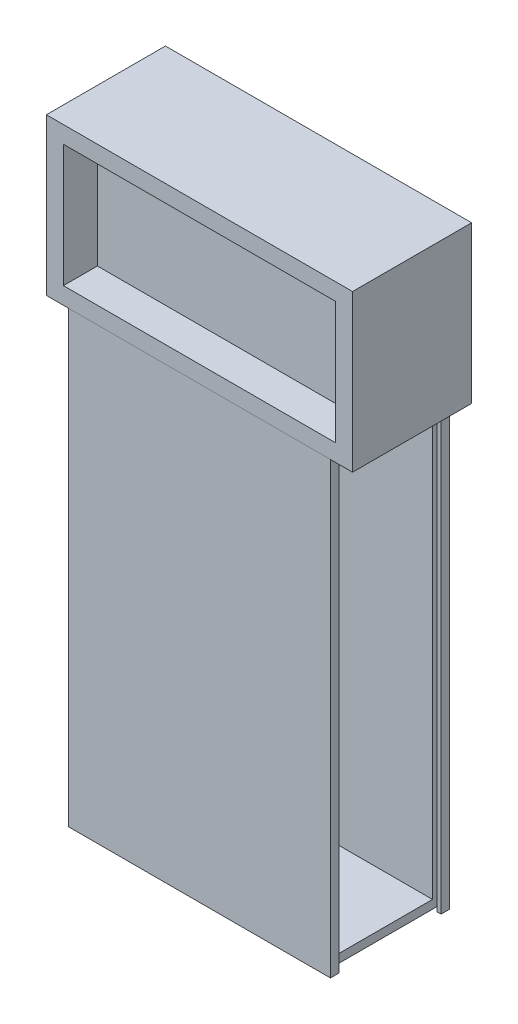
ISO-10303-21;
HEADER;
FILE_DESCRIPTION(('STEP AP214'),'2;1');
FILE_NAME('part.step','',(''),(''),'','','');
FILE_SCHEMA(('AUTOMOTIVE_DESIGN { 1 0 10303 214 1 1 1 1 }'));
ENDSEC;
DATA;
#1=APPLICATION_CONTEXT('core data for automotive mechanical design processes');
#2=APPLICATION_PROTOCOL_DEFINITION('international standard','automotive_design',2000,#1);
#3=PRODUCT_CONTEXT('',#1,'mechanical');
#4=PRODUCT('Part','Part','',(#3));
#5=PRODUCT_RELATED_PRODUCT_CATEGORY('part','',(#4));
#6=PRODUCT_DEFINITION_FORMATION('','',#4);
#7=PRODUCT_DEFINITION_CONTEXT('part definition',#1,'design');
#8=PRODUCT_DEFINITION('design','',#6,#7);
#9=PRODUCT_DEFINITION_SHAPE('','',#8);
#10=(LENGTH_UNIT() NAMED_UNIT(*) SI_UNIT(.MILLI.,.METRE.));
#11=(NAMED_UNIT(*) PLANE_ANGLE_UNIT() SI_UNIT($,.RADIAN.));
#12=(NAMED_UNIT(*) SI_UNIT($,.STERADIAN.) SOLID_ANGLE_UNIT());
#13=UNCERTAINTY_MEASURE_WITH_UNIT(LENGTH_MEASURE(1.E-05),#10,'distance_accuracy_value','');
#14=(GEOMETRIC_REPRESENTATION_CONTEXT(3) GLOBAL_UNCERTAINTY_ASSIGNED_CONTEXT((#13)) GLOBAL_UNIT_ASSIGNED_CONTEXT((#10,
#11,#12)) REPRESENTATION_CONTEXT('',''));
#15=CARTESIAN_POINT('',(0.,0.,0.));
#16=DIRECTION('',(0.,0.,1.));
#17=DIRECTION('',(1.,0.,0.));
#18=AXIS2_PLACEMENT_3D('',#15,#16,#17);
#19=CARTESIAN_POINT('',(0.,112.,35.));
#20=DIRECTION('',(0.,0.,-1.));
#21=DIRECTION('',(-1.,0.,0.));
#22=AXIS2_PLACEMENT_3D('',#19,#20,#21);
#23=PLANE('',#22);
#24=DIRECTION('',(-1.,0.,0.));
#25=VECTOR('',#24,1.);
#26=CARTESIAN_POINT('',(-40.,107.,35.));
#27=LINE('',#26,#25);
#28=CARTESIAN_POINT('',(40.,107.,35.));
#29=VERTEX_POINT('',#28);
#30=CARTESIAN_POINT('',(-40.,107.,35.));
#31=VERTEX_POINT('',#30);
#32=EDGE_CURVE('E162',#29,#31,#27,.T.);
#33=ORIENTED_EDGE('',*,*,#32,.F.);
#34=DIRECTION('',(0.,1.,0.));
#35=VECTOR('',#34,1.);
#36=CARTESIAN_POINT('',(40.,71.,35.));
#37=LINE('',#36,#35);
#38=CARTESIAN_POINT('',(40.,71.,35.));
#39=VERTEX_POINT('',#38);
#40=EDGE_CURVE('E68',#39,#29,#37,.T.);
#41=ORIENTED_EDGE('',*,*,#40,.F.);
#42=DIRECTION('',(1.,0.,0.));
#43=VECTOR('',#42,1.);
#44=CARTESIAN_POINT('',(-40.,71.,35.));
#45=LINE('',#44,#43);
#46=CARTESIAN_POINT('',(-40.,71.,35.));
#47=VERTEX_POINT('',#46);
#48=EDGE_CURVE('E149',#47,#39,#45,.T.);
#49=ORIENTED_EDGE('',*,*,#48,.F.);
#50=DIRECTION('',(0.,-1.,0.));
#51=VECTOR('',#50,1.);
#52=CARTESIAN_POINT('',(-40.,71.,35.));
#53=LINE('',#52,#51);
#54=EDGE_CURVE('E153',#31,#47,#53,.T.);
#55=ORIENTED_EDGE('',*,*,#54,.F.);
#56=EDGE_LOOP('',(#33,#41,#49,#55));
#57=FACE_BOUND('',#56,.T.);
#58=DIRECTION('',(1.,0.,0.));
#59=VECTOR('',#58,1.);
#60=CARTESIAN_POINT('',(0.,66.,35.));
#61=LINE('',#60,#59);
#62=CARTESIAN_POINT('',(-45.,66.,35.));
#63=VERTEX_POINT('',#62);
#64=CARTESIAN_POINT('',(45.,66.,35.));
#65=VERTEX_POINT('',#64);
#66=EDGE_CURVE('E171',#63,#65,#61,.T.);
#67=ORIENTED_EDGE('',*,*,#66,.T.);
#68=DIRECTION('',(0.,-1.,0.));
#69=VECTOR('',#68,1.);
#70=CARTESIAN_POINT('',(45.,112.,35.));
#71=LINE('',#70,#69);
#72=CARTESIAN_POINT('',(45.,112.,35.));
#73=VERTEX_POINT('',#72);
#74=EDGE_CURVE('E12',#73,#65,#71,.T.);
#75=ORIENTED_EDGE('',*,*,#74,.F.);
#76=DIRECTION('',(1.,0.,0.));
#77=VECTOR('',#76,1.);
#78=CARTESIAN_POINT('',(0.,112.,35.));
#79=LINE('',#78,#77);
#80=CARTESIAN_POINT('',(-45.,112.,35.));
#81=VERTEX_POINT('',#80);
#82=EDGE_CURVE('E177',#81,#73,#79,.T.);
#83=ORIENTED_EDGE('',*,*,#82,.F.);
#84=DIRECTION('',(0.,-1.,0.));
#85=VECTOR('',#84,1.);
#86=CARTESIAN_POINT('',(-45.,112.,35.));
#87=LINE('',#86,#85);
#88=EDGE_CURVE('E77',#81,#63,#87,.T.);
#89=ORIENTED_EDGE('',*,*,#88,.T.);
#90=EDGE_LOOP('',(#67,#75,#83,#89));
#91=FACE_BOUND('',#90,.T.);
#92=ADVANCED_FACE('F53',(#57,#91),#23,.F.);
#93=CARTESIAN_POINT('',(45.,112.,0.));
#94=DIRECTION('',(-1.,0.,0.));
#95=DIRECTION('',(0.,0.,1.));
#96=AXIS2_PLACEMENT_3D('',#93,#94,#95);
#97=PLANE('',#96);
#98=DIRECTION('',(0.,0.,-1.));
#99=VECTOR('',#98,1.);
#100=CARTESIAN_POINT('',(45.,66.,0.));
#101=LINE('',#100,#99);
#102=CARTESIAN_POINT('',(45.,66.,0.));
#103=VERTEX_POINT('',#102);
#104=EDGE_CURVE('E191',#65,#103,#101,.T.);
#105=ORIENTED_EDGE('',*,*,#104,.T.);
#106=DIRECTION('',(0.,-1.,0.));
#107=VECTOR('',#106,1.);
#108=CARTESIAN_POINT('',(45.,112.,0.));
#109=LINE('',#108,#107);
#110=CARTESIAN_POINT('',(45.,112.,0.));
#111=VERTEX_POINT('',#110);
#112=EDGE_CURVE('E61',#111,#103,#109,.T.);
#113=ORIENTED_EDGE('',*,*,#112,.F.);
#114=DIRECTION('',(0.,0.,-1.));
#115=VECTOR('',#114,1.);
#116=CARTESIAN_POINT('',(45.,112.,0.));
#117=LINE('',#116,#115);
#118=EDGE_CURVE('E103',#73,#111,#117,.T.);
#119=ORIENTED_EDGE('',*,*,#118,.F.);
#120=ORIENTED_EDGE('',*,*,#74,.T.);
#121=EDGE_LOOP('',(#105,#113,#119,#120));
#122=FACE_BOUND('',#121,.T.);
#123=ADVANCED_FACE('F219',(#122),#97,.F.);
#124=CARTESIAN_POINT('',(0.,112.,0.));
#125=DIRECTION('',(0.,0.,1.));
#126=DIRECTION('',(1.,0.,0.));
#127=AXIS2_PLACEMENT_3D('',#124,#125,#126);
#128=PLANE('',#127);
#129=DIRECTION('',(-1.,0.,0.));
#130=VECTOR('',#129,1.);
#131=CARTESIAN_POINT('',(0.,66.,0.));
#132=LINE('',#131,#130);
#133=CARTESIAN_POINT('',(-45.,66.,0.));
#134=VERTEX_POINT('',#133);
#135=EDGE_CURVE('E194',#103,#134,#132,.T.);
#136=ORIENTED_EDGE('',*,*,#135,.T.);
#137=DIRECTION('',(0.,-1.,0.));
#138=VECTOR('',#137,1.);
#139=CARTESIAN_POINT('',(-45.,112.,0.));
#140=LINE('',#139,#138);
#141=CARTESIAN_POINT('',(-45.,112.,0.));
#142=VERTEX_POINT('',#141);
#143=EDGE_CURVE('E203',#142,#134,#140,.T.);
#144=ORIENTED_EDGE('',*,*,#143,.F.);
#145=DIRECTION('',(-1.,0.,0.));
#146=VECTOR('',#145,1.);
#147=CARTESIAN_POINT('',(0.,112.,0.));
#148=LINE('',#147,#146);
#149=EDGE_CURVE('E183',#111,#142,#148,.T.);
#150=ORIENTED_EDGE('',*,*,#149,.F.);
#151=ORIENTED_EDGE('',*,*,#112,.T.);
#152=EDGE_LOOP('',(#136,#144,#150,#151));
#153=FACE_BOUND('',#152,.T.);
#154=ADVANCED_FACE('F210',(#153),#128,.F.);
#155=CARTESIAN_POINT('',(-45.,112.,0.));
#156=DIRECTION('',(-1.,0.,0.));
#157=DIRECTION('',(0.,0.,1.));
#158=AXIS2_PLACEMENT_3D('',#155,#156,#157);
#159=PLANE('',#158);
#160=DIRECTION('',(0.,0.,-1.));
#161=VECTOR('',#160,1.);
#162=CARTESIAN_POINT('',(-45.,66.,0.));
#163=LINE('',#162,#161);
#164=EDGE_CURVE('E180',#63,#134,#163,.T.);
#165=ORIENTED_EDGE('',*,*,#164,.F.);
#166=ORIENTED_EDGE('',*,*,#88,.F.);
#167=DIRECTION('',(0.,0.,-1.));
#168=VECTOR('',#167,1.);
#169=CARTESIAN_POINT('',(-45.,112.,0.));
#170=LINE('',#169,#168);
#171=EDGE_CURVE('E186',#81,#142,#170,.T.);
#172=ORIENTED_EDGE('',*,*,#171,.T.);
#173=ORIENTED_EDGE('',*,*,#143,.T.);
#174=EDGE_LOOP('',(#165,#166,#172,#173));
#175=FACE_BOUND('',#174,.T.);
#176=ADVANCED_FACE('F214',(#175),#159,.T.);
#177=CARTESIAN_POINT('',(0.,112.,0.));
#178=DIRECTION('',(0.,1.,0.));
#179=DIRECTION('',(0.,0.,1.));
#180=AXIS2_PLACEMENT_3D('',#177,#178,#179);
#181=PLANE('',#180);
#182=ORIENTED_EDGE('',*,*,#82,.T.);
#183=ORIENTED_EDGE('',*,*,#118,.T.);
#184=ORIENTED_EDGE('',*,*,#149,.T.);
#185=ORIENTED_EDGE('',*,*,#171,.F.);
#186=EDGE_LOOP('',(#182,#183,#184,#185));
#187=FACE_BOUND('',#186,.T.);
#188=ADVANCED_FACE('F217',(#187),#181,.T.);
#189=CARTESIAN_POINT('',(0.,66.,0.));
#190=DIRECTION('',(0.,1.,0.));
#191=DIRECTION('',(0.,0.,1.));
#192=AXIS2_PLACEMENT_3D('',#189,#190,#191);
#193=PLANE('',#192);
#194=ORIENTED_EDGE('',*,*,#66,.F.);
#195=ORIENTED_EDGE('',*,*,#164,.T.);
#196=ORIENTED_EDGE('',*,*,#135,.F.);
#197=ORIENTED_EDGE('',*,*,#104,.F.);
#198=EDGE_LOOP('',(#194,#195,#196,#197));
#199=FACE_BOUND('',#198,.T.);
#200=ADVANCED_FACE('F213',(#199),#193,.F.);
#201=CARTESIAN_POINT('',(40.,71.,25.));
#202=DIRECTION('',(1.,0.,0.));
#203=DIRECTION('',(0.,0.,-1.));
#204=AXIS2_PLACEMENT_3D('',#201,#202,#203);
#205=PLANE('',#204);
#206=ORIENTED_EDGE('',*,*,#40,.T.);
#207=DIRECTION('',(0.,0.,1.));
#208=VECTOR('',#207,1.);
#209=CARTESIAN_POINT('',(40.,107.,25.));
#210=LINE('',#209,#208);
#211=CARTESIAN_POINT('',(40.,107.,25.));
#212=VERTEX_POINT('',#211);
#213=EDGE_CURVE('E124',#212,#29,#210,.T.);
#214=ORIENTED_EDGE('',*,*,#213,.F.);
#215=DIRECTION('',(0.,1.,0.));
#216=VECTOR('',#215,1.);
#217=CARTESIAN_POINT('',(40.,71.,25.));
#218=LINE('',#217,#216);
#219=CARTESIAN_POINT('',(40.,71.,25.));
#220=VERTEX_POINT('',#219);
#221=EDGE_CURVE('E128',#220,#212,#218,.T.);
#222=ORIENTED_EDGE('',*,*,#221,.F.);
#223=DIRECTION('',(0.,0.,1.));
#224=VECTOR('',#223,1.);
#225=CARTESIAN_POINT('',(40.,71.,25.));
#226=LINE('',#225,#224);
#227=EDGE_CURVE('E168',#220,#39,#226,.T.);
#228=ORIENTED_EDGE('',*,*,#227,.T.);
#229=EDGE_LOOP('',(#206,#214,#222,#228));
#230=FACE_BOUND('',#229,.T.);
#231=ADVANCED_FACE('F126',(#230),#205,.F.);
#232=CARTESIAN_POINT('',(-40.,71.,25.));
#233=DIRECTION('',(0.,-1.,0.));
#234=DIRECTION('',(0.,0.,-1.));
#235=AXIS2_PLACEMENT_3D('',#232,#233,#234);
#236=PLANE('',#235);
#237=ORIENTED_EDGE('',*,*,#48,.T.);
#238=ORIENTED_EDGE('',*,*,#227,.F.);
#239=DIRECTION('',(1.,0.,0.));
#240=VECTOR('',#239,1.);
#241=CARTESIAN_POINT('',(-40.,71.,25.));
#242=LINE('',#241,#240);
#243=CARTESIAN_POINT('',(-40.,71.,25.));
#244=VERTEX_POINT('',#243);
#245=EDGE_CURVE('E135',#244,#220,#242,.T.);
#246=ORIENTED_EDGE('',*,*,#245,.F.);
#247=DIRECTION('',(0.,0.,1.));
#248=VECTOR('',#247,1.);
#249=CARTESIAN_POINT('',(-40.,71.,25.));
#250=LINE('',#249,#248);
#251=EDGE_CURVE('E172',#244,#47,#250,.T.);
#252=ORIENTED_EDGE('',*,*,#251,.T.);
#253=EDGE_LOOP('',(#237,#238,#246,#252));
#254=FACE_BOUND('',#253,.T.);
#255=ADVANCED_FACE('F236',(#254),#236,.F.);
#256=CARTESIAN_POINT('',(-40.,71.,25.));
#257=DIRECTION('',(-1.,0.,0.));
#258=DIRECTION('',(0.,0.,1.));
#259=AXIS2_PLACEMENT_3D('',#256,#257,#258);
#260=PLANE('',#259);
#261=ORIENTED_EDGE('',*,*,#54,.T.);
#262=ORIENTED_EDGE('',*,*,#251,.F.);
#263=DIRECTION('',(0.,-1.,0.));
#264=VECTOR('',#263,1.);
#265=CARTESIAN_POINT('',(-40.,71.,25.));
#266=LINE('',#265,#264);
#267=CARTESIAN_POINT('',(-40.,107.,25.));
#268=VERTEX_POINT('',#267);
#269=EDGE_CURVE('E144',#268,#244,#266,.T.);
#270=ORIENTED_EDGE('',*,*,#269,.F.);
#271=DIRECTION('',(0.,0.,1.));
#272=VECTOR('',#271,1.);
#273=CARTESIAN_POINT('',(-40.,107.,25.));
#274=LINE('',#273,#272);
#275=EDGE_CURVE('E134',#268,#31,#274,.T.);
#276=ORIENTED_EDGE('',*,*,#275,.T.);
#277=EDGE_LOOP('',(#261,#262,#270,#276));
#278=FACE_BOUND('',#277,.T.);
#279=ADVANCED_FACE('F239',(#278),#260,.F.);
#280=CARTESIAN_POINT('',(-40.,107.,25.));
#281=DIRECTION('',(0.,1.,0.));
#282=DIRECTION('',(0.,0.,1.));
#283=AXIS2_PLACEMENT_3D('',#280,#281,#282);
#284=PLANE('',#283);
#285=ORIENTED_EDGE('',*,*,#32,.T.);
#286=ORIENTED_EDGE('',*,*,#275,.F.);
#287=DIRECTION('',(-1.,0.,0.));
#288=VECTOR('',#287,1.);
#289=CARTESIAN_POINT('',(-40.,107.,25.));
#290=LINE('',#289,#288);
#291=EDGE_CURVE('E138',#212,#268,#290,.T.);
#292=ORIENTED_EDGE('',*,*,#291,.F.);
#293=ORIENTED_EDGE('',*,*,#213,.T.);
#294=EDGE_LOOP('',(#285,#286,#292,#293));
#295=FACE_BOUND('',#294,.T.);
#296=ADVANCED_FACE('F139',(#295),#284,.F.);
#297=CARTESIAN_POINT('',(0.,0.,25.));
#298=DIRECTION('',(0.,0.,-1.));
#299=DIRECTION('',(-1.,0.,0.));
#300=AXIS2_PLACEMENT_3D('',#297,#298,#299);
#301=PLANE('',#300);
#302=ORIENTED_EDGE('',*,*,#221,.T.);
#303=ORIENTED_EDGE('',*,*,#291,.T.);
#304=ORIENTED_EDGE('',*,*,#269,.T.);
#305=ORIENTED_EDGE('',*,*,#245,.T.);
#306=EDGE_LOOP('',(#302,#303,#304,#305));
#307=FACE_BOUND('',#306,.T.);
#308=ADVANCED_FACE('F146',(#307),#301,.F.);
#309=CLOSED_SHELL('',(#92,#123,#154,#176,#188,#200,#231,#255,#279,#296,#308));
#310=MANIFOLD_SOLID_BREP('B2',#309);
#311=CARTESIAN_POINT('',(0.,0.,32.5));
#312=DIRECTION('',(0.,0.,-1.));
#313=DIRECTION('',(-1.,0.,0.));
#314=AXIS2_PLACEMENT_3D('',#311,#312,#313);
#315=PLANE('',#314);
#316=DIRECTION('',(0.,-1.,0.));
#317=VECTOR('',#316,1.);
#318=CARTESIAN_POINT('',(36.,112.002,32.5));
#319=LINE('',#318,#317);
#320=CARTESIAN_POINT('',(36.,63.5,32.5));
#321=VERTEX_POINT('',#320);
#322=CARTESIAN_POINT('',(36.,-63.5,32.5));
#323=VERTEX_POINT('',#322);
#324=EDGE_CURVE('E374',#321,#323,#319,.T.);
#325=ORIENTED_EDGE('',*,*,#324,.T.);
#326=DIRECTION('',(1.,0.,0.));
#327=VECTOR('',#326,1.);
#328=CARTESIAN_POINT('',(0.,-63.5,32.5));
#329=LINE('',#328,#327);
#330=CARTESIAN_POINT('',(-36.,-63.5,32.5));
#331=VERTEX_POINT('',#330);
#332=EDGE_CURVE('E537',#331,#323,#329,.T.);
#333=ORIENTED_EDGE('',*,*,#332,.F.);
#334=DIRECTION('',(0.,-1.,0.));
#335=VECTOR('',#334,1.);
#336=CARTESIAN_POINT('',(-36.,0.,32.5));
#337=LINE('',#336,#335);
#338=CARTESIAN_POINT('',(-36.,63.5,32.5));
#339=VERTEX_POINT('',#338);
#340=EDGE_CURVE('E531',#339,#331,#337,.T.);
#341=ORIENTED_EDGE('',*,*,#340,.F.);
#342=DIRECTION('',(-1.,0.,0.));
#343=VECTOR('',#342,1.);
#344=CARTESIAN_POINT('',(0.,63.5,32.5));
#345=LINE('',#344,#343);
#346=EDGE_CURVE('E529',#321,#339,#345,.T.);
#347=ORIENTED_EDGE('',*,*,#346,.F.);
#348=EDGE_LOOP('',(#325,#333,#341,#347));
#349=FACE_BOUND('',#348,.T.);
#350=ADVANCED_FACE('F359',(#349),#315,.T.);
#351=CARTESIAN_POINT('',(0.,0.,2.5));
#352=DIRECTION('',(0.,0.,-1.));
#353=DIRECTION('',(-1.,0.,0.));
#354=AXIS2_PLACEMENT_3D('',#351,#352,#353);
#355=PLANE('',#354);
#356=DIRECTION('',(1.,0.,0.));
#357=VECTOR('',#356,1.);
#358=CARTESIAN_POINT('',(0.,-63.5,2.5));
#359=LINE('',#358,#357);
#360=CARTESIAN_POINT('',(-36.,-63.5,2.5));
#361=VERTEX_POINT('',#360);
#362=CARTESIAN_POINT('',(36.,-63.5,2.5));
#363=VERTEX_POINT('',#362);
#364=EDGE_CURVE('E534',#361,#363,#359,.T.);
#365=ORIENTED_EDGE('',*,*,#364,.T.);
#366=DIRECTION('',(0.,-1.,0.));
#367=VECTOR('',#366,1.);
#368=CARTESIAN_POINT('',(36.,112.002,2.5));
#369=LINE('',#368,#367);
#370=CARTESIAN_POINT('',(36.,63.5,2.5));
#371=VERTEX_POINT('',#370);
#372=EDGE_CURVE('E779',#371,#363,#369,.T.);
#373=ORIENTED_EDGE('',*,*,#372,.F.);
#374=DIRECTION('',(-1.,0.,0.));
#375=VECTOR('',#374,1.);
#376=CARTESIAN_POINT('',(0.,63.5,2.5));
#377=LINE('',#376,#375);
#378=CARTESIAN_POINT('',(-36.,63.5,2.5));
#379=VERTEX_POINT('',#378);
#380=EDGE_CURVE('E521',#371,#379,#377,.T.);
#381=ORIENTED_EDGE('',*,*,#380,.T.);
#382=DIRECTION('',(0.,-1.,0.));
#383=VECTOR('',#382,1.);
#384=CARTESIAN_POINT('',(-36.,0.,2.5));
#385=LINE('',#384,#383);
#386=EDGE_CURVE('E523',#379,#361,#385,.T.);
#387=ORIENTED_EDGE('',*,*,#386,.T.);
#388=EDGE_LOOP('',(#365,#373,#381,#387));
#389=FACE_BOUND('',#388,.T.);
#390=ADVANCED_FACE('F589',(#389),#355,.F.);
#391=CARTESIAN_POINT('',(38.5,-66.,35.));
#392=DIRECTION('',(-1.,0.,0.));
#393=DIRECTION('',(0.,0.,1.));
#394=AXIS2_PLACEMENT_3D('',#391,#392,#393);
#395=PLANE('',#394);
#396=DIRECTION('',(0.,0.,-1.));
#397=VECTOR('',#396,1.);
#398=CARTESIAN_POINT('',(38.5,-66.,35.));
#399=LINE('',#398,#397);
#400=CARTESIAN_POINT('',(38.5,-66.,35.));
#401=VERTEX_POINT('',#400);
#402=CARTESIAN_POINT('',(38.5,-66.,32.5));
#403=VERTEX_POINT('',#402);
#404=EDGE_CURVE('E559',#401,#403,#399,.T.);
#405=ORIENTED_EDGE('',*,*,#404,.T.);
#406=DIRECTION('',(0.,1.,0.));
#407=VECTOR('',#406,1.);
#408=CARTESIAN_POINT('',(38.5,0.,32.5));
#409=LINE('',#408,#407);
#410=CARTESIAN_POINT('',(38.5,66.,32.5));
#411=VERTEX_POINT('',#410);
#412=EDGE_CURVE('E532',#403,#411,#409,.T.);
#413=ORIENTED_EDGE('',*,*,#412,.T.);
#414=DIRECTION('',(0.,0.,-1.));
#415=VECTOR('',#414,1.);
#416=CARTESIAN_POINT('',(38.5,66.,35.));
#417=LINE('',#416,#415);
#418=CARTESIAN_POINT('',(38.5,66.,35.));
#419=VERTEX_POINT('',#418);
#420=EDGE_CURVE('E51',#419,#411,#417,.T.);
#421=ORIENTED_EDGE('',*,*,#420,.F.);
#422=DIRECTION('',(0.,1.,0.));
#423=VECTOR('',#422,1.);
#424=CARTESIAN_POINT('',(38.5,-66.,35.));
#425=LINE('',#424,#423);
#426=EDGE_CURVE('E546',#401,#419,#425,.T.);
#427=ORIENTED_EDGE('',*,*,#426,.F.);
#428=EDGE_LOOP('',(#405,#413,#421,#427));
#429=FACE_BOUND('',#428,.T.);
#430=ADVANCED_FACE('F579',(#429),#395,.F.);
#431=CARTESIAN_POINT('',(-38.5,63.5,35.));
#432=DIRECTION('',(0.,-1.,0.));
#433=DIRECTION('',(0.,0.,-1.));
#434=AXIS2_PLACEMENT_3D('',#431,#432,#433);
#435=PLANE('',#434);
#436=ORIENTED_EDGE('',*,*,#380,.F.);
#437=DIRECTION('',(0.,0.,1.));
#438=VECTOR('',#437,1.);
#439=CARTESIAN_POINT('',(36.,63.5,35.));
#440=LINE('',#439,#438);
#441=EDGE_CURVE('E509',#371,#321,#440,.T.);
#442=ORIENTED_EDGE('',*,*,#441,.T.);
#443=ORIENTED_EDGE('',*,*,#346,.T.);
#444=DIRECTION('',(0.,0.,-1.));
#445=VECTOR('',#444,1.);
#446=CARTESIAN_POINT('',(-36.,63.5,35.));
#447=LINE('',#446,#445);
#448=EDGE_CURVE('E524',#339,#379,#447,.T.);
#449=ORIENTED_EDGE('',*,*,#448,.T.);
#450=EDGE_LOOP('',(#436,#442,#443,#449));
#451=FACE_BOUND('',#450,.T.);
#452=ADVANCED_FACE('F585',(#451),#435,.T.);
#453=CARTESIAN_POINT('',(-38.5,-63.5,35.));
#454=DIRECTION('',(0.,1.,0.));
#455=DIRECTION('',(0.,0.,1.));
#456=AXIS2_PLACEMENT_3D('',#453,#454,#455);
#457=PLANE('',#456);
#458=ORIENTED_EDGE('',*,*,#332,.T.);
#459=DIRECTION('',(0.,0.,-1.));
#460=VECTOR('',#459,1.);
#461=CARTESIAN_POINT('',(36.,-63.5,35.));
#462=LINE('',#461,#460);
#463=EDGE_CURVE('E505',#323,#363,#462,.T.);
#464=ORIENTED_EDGE('',*,*,#463,.T.);
#465=ORIENTED_EDGE('',*,*,#364,.F.);
#466=DIRECTION('',(0.,0.,-1.));
#467=VECTOR('',#466,1.);
#468=CARTESIAN_POINT('',(-36.,-63.5,35.));
#469=LINE('',#468,#467);
#470=EDGE_CURVE('E528',#331,#361,#469,.T.);
#471=ORIENTED_EDGE('',*,*,#470,.F.);
#472=EDGE_LOOP('',(#458,#464,#465,#471));
#473=FACE_BOUND('',#472,.T.);
#474=ADVANCED_FACE('F578',(#473),#457,.T.);
#475=CARTESIAN_POINT('',(38.5,66.,2.5));
#476=VERTEX_POINT('',#475);
#477=CARTESIAN_POINT('',(38.5,66.,0.));
#478=VERTEX_POINT('',#477);
#479=EDGE_CURVE('E367',#476,#478,#417,.T.);
#480=ORIENTED_EDGE('',*,*,#479,.F.);
#481=DIRECTION('',(0.,1.,0.));
#482=VECTOR('',#481,1.);
#483=CARTESIAN_POINT('',(38.5,0.,2.5));
#484=LINE('',#483,#482);
#485=CARTESIAN_POINT('',(38.5,-66.,2.5));
#486=VERTEX_POINT('',#485);
#487=EDGE_CURVE('E520',#486,#476,#484,.T.);
#488=ORIENTED_EDGE('',*,*,#487,.F.);
#489=CARTESIAN_POINT('',(38.5,-66.,0.));
#490=VERTEX_POINT('',#489);
#491=EDGE_CURVE('E405',#486,#490,#399,.T.);
#492=ORIENTED_EDGE('',*,*,#491,.T.);
#493=DIRECTION('',(0.,1.,0.));
#494=VECTOR('',#493,1.);
#495=CARTESIAN_POINT('',(38.5,-66.,0.));
#496=LINE('',#495,#494);
#497=EDGE_CURVE('E527',#490,#478,#496,.T.);
#498=ORIENTED_EDGE('',*,*,#497,.T.);
#499=EDGE_LOOP('',(#480,#488,#492,#498));
#500=FACE_BOUND('',#499,.T.);
#501=ADVANCED_FACE('F361',(#500),#395,.F.);
#502=CARTESIAN_POINT('',(-38.5,66.,35.));
#503=DIRECTION('',(0.,-1.,0.));
#504=DIRECTION('',(0.,0.,-1.));
#505=AXIS2_PLACEMENT_3D('',#502,#503,#504);
#506=PLANE('',#505);
#507=DIRECTION('',(-1.,0.,0.));
#508=VECTOR('',#507,1.);
#509=CARTESIAN_POINT('',(36.,66.,33.75));
#510=LINE('',#509,#508);
#511=CARTESIAN_POINT('',(37.25,66.,33.75));
#512=VERTEX_POINT('',#511);
#513=CARTESIAN_POINT('',(36.,66.,33.75));
#514=VERTEX_POINT('',#513);
#515=EDGE_CURVE('E492',#512,#514,#510,.T.);
#516=ORIENTED_EDGE('',*,*,#515,.T.);
#517=DIRECTION('',(0.,0.,1.));
#518=VECTOR('',#517,1.);
#519=CARTESIAN_POINT('',(36.,66.,32.5));
#520=LINE('',#519,#518);
#521=CARTESIAN_POINT('',(36.,66.,1.25));
#522=VERTEX_POINT('',#521);
#523=EDGE_CURVE('E514',#522,#514,#520,.T.);
#524=ORIENTED_EDGE('',*,*,#523,.F.);
#525=DIRECTION('',(1.,0.,0.));
#526=VECTOR('',#525,1.);
#527=CARTESIAN_POINT('',(36.,66.,1.25));
#528=LINE('',#527,#526);
#529=CARTESIAN_POINT('',(37.25,66.,1.25));
#530=VERTEX_POINT('',#529);
#531=EDGE_CURVE('E493',#522,#530,#528,.T.);
#532=ORIENTED_EDGE('',*,*,#531,.T.);
#533=DIRECTION('',(0.,0.,1.));
#534=VECTOR('',#533,1.);
#535=CARTESIAN_POINT('',(37.25,66.,2.5));
#536=LINE('',#535,#534);
#537=CARTESIAN_POINT('',(37.25,66.,2.5));
#538=VERTEX_POINT('',#537);
#539=EDGE_CURVE('E789',#530,#538,#536,.T.);
#540=ORIENTED_EDGE('',*,*,#539,.T.);
#541=DIRECTION('',(1.,0.,0.));
#542=VECTOR('',#541,1.);
#543=CARTESIAN_POINT('',(36.,66.,2.5));
#544=LINE('',#543,#542);
#545=EDGE_CURVE('E506',#538,#476,#544,.T.);
#546=ORIENTED_EDGE('',*,*,#545,.T.);
#547=ORIENTED_EDGE('',*,*,#479,.T.);
#548=DIRECTION('',(-1.,0.,0.));
#549=VECTOR('',#548,1.);
#550=CARTESIAN_POINT('',(-38.5,66.,0.));
#551=LINE('',#550,#549);
#552=CARTESIAN_POINT('',(-38.5,66.,0.));
#553=VERTEX_POINT('',#552);
#554=EDGE_CURVE('E554',#478,#553,#551,.T.);
#555=ORIENTED_EDGE('',*,*,#554,.T.);
#556=DIRECTION('',(0.,0.,-1.));
#557=VECTOR('',#556,1.);
#558=CARTESIAN_POINT('',(-38.5,66.,35.));
#559=LINE('',#558,#557);
#560=CARTESIAN_POINT('',(-38.5,66.,35.));
#561=VERTEX_POINT('',#560);
#562=EDGE_CURVE('E564',#561,#553,#559,.T.);
#563=ORIENTED_EDGE('',*,*,#562,.F.);
#564=DIRECTION('',(-1.,0.,0.));
#565=VECTOR('',#564,1.);
#566=CARTESIAN_POINT('',(-38.5,66.,35.));
#567=LINE('',#566,#565);
#568=EDGE_CURVE('E412',#419,#561,#567,.T.);
#569=ORIENTED_EDGE('',*,*,#568,.F.);
#570=ORIENTED_EDGE('',*,*,#420,.T.);
#571=DIRECTION('',(1.,0.,0.));
#572=VECTOR('',#571,1.);
#573=CARTESIAN_POINT('',(36.,66.,32.5));
#574=LINE('',#573,#572);
#575=CARTESIAN_POINT('',(37.25,66.,32.5));
#576=VERTEX_POINT('',#575);
#577=EDGE_CURVE('E499',#576,#411,#574,.T.);
#578=ORIENTED_EDGE('',*,*,#577,.F.);
#579=DIRECTION('',(0.,0.,1.));
#580=VECTOR('',#579,1.);
#581=CARTESIAN_POINT('',(37.25,66.,32.5));
#582=LINE('',#581,#580);
#583=EDGE_CURVE('E483',#576,#512,#582,.T.);
#584=ORIENTED_EDGE('',*,*,#583,.T.);
#585=EDGE_LOOP('',(#516,#524,#532,#540,#546,#547,#555,#563,#569,#570,#578,#584));
#586=FACE_BOUND('',#585,.T.);
#587=ADVANCED_FACE('F503',(#586),#506,.F.);
#588=CARTESIAN_POINT('',(-38.5,-66.,35.));
#589=DIRECTION('',(1.,0.,0.));
#590=DIRECTION('',(0.,0.,-1.));
#591=AXIS2_PLACEMENT_3D('',#588,#589,#590);
#592=PLANE('',#591);
#593=DIRECTION('',(0.,-1.,0.));
#594=VECTOR('',#593,1.);
#595=CARTESIAN_POINT('',(-38.5,-66.,0.));
#596=LINE('',#595,#594);
#597=CARTESIAN_POINT('',(-38.5,-66.,0.));
#598=VERTEX_POINT('',#597);
#599=EDGE_CURVE('E556',#553,#598,#596,.T.);
#600=ORIENTED_EDGE('',*,*,#599,.T.);
#601=DIRECTION('',(0.,0.,-1.));
#602=VECTOR('',#601,1.);
#603=CARTESIAN_POINT('',(-38.5,-66.,35.));
#604=LINE('',#603,#602);
#605=CARTESIAN_POINT('',(-38.5,-66.,35.));
#606=VERTEX_POINT('',#605);
#607=EDGE_CURVE('E562',#606,#598,#604,.T.);
#608=ORIENTED_EDGE('',*,*,#607,.F.);
#609=DIRECTION('',(0.,-1.,0.));
#610=VECTOR('',#609,1.);
#611=CARTESIAN_POINT('',(-38.5,-66.,35.));
#612=LINE('',#611,#610);
#613=EDGE_CURVE('E550',#561,#606,#612,.T.);
#614=ORIENTED_EDGE('',*,*,#613,.F.);
#615=ORIENTED_EDGE('',*,*,#562,.T.);
#616=EDGE_LOOP('',(#600,#608,#614,#615));
#617=FACE_BOUND('',#616,.T.);
#618=ADVANCED_FACE('F584',(#617),#592,.F.);
#619=CARTESIAN_POINT('',(-38.5,-66.,35.));
#620=DIRECTION('',(0.,1.,0.));
#621=DIRECTION('',(0.,0.,1.));
#622=AXIS2_PLACEMENT_3D('',#619,#620,#621);
#623=PLANE('',#622);
#624=DIRECTION('',(0.,0.,-1.));
#625=VECTOR('',#624,1.);
#626=CARTESIAN_POINT('',(36.,-66.,32.5));
#627=LINE('',#626,#625);
#628=CARTESIAN_POINT('',(36.,-66.,33.75));
#629=VERTEX_POINT('',#628);
#630=CARTESIAN_POINT('',(36.,-66.,1.25));
#631=VERTEX_POINT('',#630);
#632=EDGE_CURVE('E766',#629,#631,#627,.T.);
#633=ORIENTED_EDGE('',*,*,#632,.F.);
#634=DIRECTION('',(-1.,0.,0.));
#635=VECTOR('',#634,1.);
#636=CARTESIAN_POINT('',(36.,-66.,33.75));
#637=LINE('',#636,#635);
#638=CARTESIAN_POINT('',(37.25,-66.,33.75));
#639=VERTEX_POINT('',#638);
#640=EDGE_CURVE('E763',#639,#629,#637,.T.);
#641=ORIENTED_EDGE('',*,*,#640,.F.);
#642=DIRECTION('',(0.,0.,1.));
#643=VECTOR('',#642,1.);
#644=CARTESIAN_POINT('',(37.25,-66.,32.5));
#645=LINE('',#644,#643);
#646=CARTESIAN_POINT('',(37.25,-66.,32.5));
#647=VERTEX_POINT('',#646);
#648=EDGE_CURVE('E761',#647,#639,#645,.T.);
#649=ORIENTED_EDGE('',*,*,#648,.F.);
#650=DIRECTION('',(1.,0.,0.));
#651=VECTOR('',#650,1.);
#652=CARTESIAN_POINT('',(36.,-66.,32.5));
#653=LINE('',#652,#651);
#654=EDGE_CURVE('E501',#647,#403,#653,.T.);
#655=ORIENTED_EDGE('',*,*,#654,.T.);
#656=ORIENTED_EDGE('',*,*,#404,.F.);
#657=DIRECTION('',(1.,0.,0.));
#658=VECTOR('',#657,1.);
#659=CARTESIAN_POINT('',(-38.5,-66.,35.));
#660=LINE('',#659,#658);
#661=EDGE_CURVE('E383',#606,#401,#660,.T.);
#662=ORIENTED_EDGE('',*,*,#661,.F.);
#663=ORIENTED_EDGE('',*,*,#607,.T.);
#664=DIRECTION('',(1.,0.,0.));
#665=VECTOR('',#664,1.);
#666=CARTESIAN_POINT('',(-38.5,-66.,0.));
#667=LINE('',#666,#665);
#668=EDGE_CURVE('E548',#598,#490,#667,.T.);
#669=ORIENTED_EDGE('',*,*,#668,.T.);
#670=ORIENTED_EDGE('',*,*,#491,.F.);
#671=DIRECTION('',(1.,0.,0.));
#672=VECTOR('',#671,1.);
#673=CARTESIAN_POINT('',(36.,-66.,2.5));
#674=LINE('',#673,#672);
#675=CARTESIAN_POINT('',(37.25,-66.,2.5));
#676=VERTEX_POINT('',#675);
#677=EDGE_CURVE('E511',#676,#486,#674,.T.);
#678=ORIENTED_EDGE('',*,*,#677,.F.);
#679=DIRECTION('',(0.,0.,1.));
#680=VECTOR('',#679,1.);
#681=CARTESIAN_POINT('',(37.25,-66.,2.5));
#682=LINE('',#681,#680);
#683=CARTESIAN_POINT('',(37.25,-66.,1.25));
#684=VERTEX_POINT('',#683);
#685=EDGE_CURVE('E777',#684,#676,#682,.T.);
#686=ORIENTED_EDGE('',*,*,#685,.F.);
#687=DIRECTION('',(1.,0.,0.));
#688=VECTOR('',#687,1.);
#689=CARTESIAN_POINT('',(36.,-66.,1.25));
#690=LINE('',#689,#688);
#691=EDGE_CURVE('E774',#631,#684,#690,.T.);
#692=ORIENTED_EDGE('',*,*,#691,.F.);
#693=EDGE_LOOP('',(#633,#641,#649,#655,#656,#662,#663,#669,#670,#678,#686,#692));
#694=FACE_BOUND('',#693,.T.);
#695=ADVANCED_FACE('F684',(#694),#623,.F.);
#696=CARTESIAN_POINT('',(0.,0.,35.));
#697=DIRECTION('',(0.,0.,-1.));
#698=DIRECTION('',(-1.,0.,0.));
#699=AXIS2_PLACEMENT_3D('',#696,#697,#698);
#700=PLANE('',#699);
#701=ORIENTED_EDGE('',*,*,#426,.T.);
#702=ORIENTED_EDGE('',*,*,#568,.T.);
#703=ORIENTED_EDGE('',*,*,#613,.T.);
#704=ORIENTED_EDGE('',*,*,#661,.T.);
#705=EDGE_LOOP('',(#701,#702,#703,#704));
#706=FACE_BOUND('',#705,.T.);
#707=ADVANCED_FACE('F613',(#706),#700,.F.);
#708=CARTESIAN_POINT('',(0.,0.,0.));
#709=DIRECTION('',(0.,0.,-1.));
#710=DIRECTION('',(-1.,0.,0.));
#711=AXIS2_PLACEMENT_3D('',#708,#709,#710);
#712=PLANE('',#711);
#713=ORIENTED_EDGE('',*,*,#497,.F.);
#714=ORIENTED_EDGE('',*,*,#668,.F.);
#715=ORIENTED_EDGE('',*,*,#599,.F.);
#716=ORIENTED_EDGE('',*,*,#554,.F.);
#717=EDGE_LOOP('',(#713,#714,#715,#716));
#718=FACE_BOUND('',#717,.T.);
#719=ADVANCED_FACE('F575',(#718),#712,.T.);
#720=CARTESIAN_POINT('',(-36.,-66.,35.));
#721=DIRECTION('',(1.,0.,0.));
#722=DIRECTION('',(0.,0.,-1.));
#723=AXIS2_PLACEMENT_3D('',#720,#721,#722);
#724=PLANE('',#723);
#725=ORIENTED_EDGE('',*,*,#386,.F.);
#726=ORIENTED_EDGE('',*,*,#448,.F.);
#727=ORIENTED_EDGE('',*,*,#340,.T.);
#728=ORIENTED_EDGE('',*,*,#470,.T.);
#729=EDGE_LOOP('',(#725,#726,#727,#728));
#730=FACE_BOUND('',#729,.T.);
#731=ADVANCED_FACE('F601',(#730),#724,.T.);
#732=DIRECTION('',(0.,-1.,0.));
#733=VECTOR('',#732,1.);
#734=CARTESIAN_POINT('',(37.25,112.002,32.5));
#735=LINE('',#734,#733);
#736=EDGE_CURVE('E487',#576,#647,#735,.T.);
#737=ORIENTED_EDGE('',*,*,#736,.F.);
#738=ORIENTED_EDGE('',*,*,#577,.T.);
#739=ORIENTED_EDGE('',*,*,#412,.F.);
#740=ORIENTED_EDGE('',*,*,#654,.F.);
#741=EDGE_LOOP('',(#737,#738,#739,#740));
#742=FACE_BOUND('',#741,.T.);
#743=ADVANCED_FACE('F497',(#742),#315,.T.);
#744=ORIENTED_EDGE('',*,*,#545,.F.);
#745=DIRECTION('',(0.,-1.,0.));
#746=VECTOR('',#745,1.);
#747=CARTESIAN_POINT('',(37.25,112.002,2.5));
#748=LINE('',#747,#746);
#749=EDGE_CURVE('E781',#538,#676,#748,.T.);
#750=ORIENTED_EDGE('',*,*,#749,.T.);
#751=ORIENTED_EDGE('',*,*,#677,.T.);
#752=ORIENTED_EDGE('',*,*,#487,.T.);
#753=EDGE_LOOP('',(#744,#750,#751,#752));
#754=FACE_BOUND('',#753,.T.);
#755=ADVANCED_FACE('F599',(#754),#355,.F.);
#756=CARTESIAN_POINT('',(36.,0.,0.));
#757=DIRECTION('',(1.,0.,0.));
#758=DIRECTION('',(0.,0.,-1.));
#759=AXIS2_PLACEMENT_3D('',#756,#757,#758);
#760=PLANE('',#759);
#761=DIRECTION('',(0.,-1.,0.));
#762=VECTOR('',#761,1.);
#763=CARTESIAN_POINT('',(36.,112.002,33.75));
#764=LINE('',#763,#762);
#765=EDGE_CURVE('E764',#514,#629,#764,.T.);
#766=ORIENTED_EDGE('',*,*,#765,.T.);
#767=ORIENTED_EDGE('',*,*,#632,.T.);
#768=DIRECTION('',(0.,-1.,0.));
#769=VECTOR('',#768,1.);
#770=CARTESIAN_POINT('',(36.,112.002,1.25));
#771=LINE('',#770,#769);
#772=EDGE_CURVE('E786',#522,#631,#771,.T.);
#773=ORIENTED_EDGE('',*,*,#772,.F.);
#774=ORIENTED_EDGE('',*,*,#523,.T.);
#775=EDGE_LOOP('',(#766,#767,#773,#774));
#776=FACE_BOUND('',#775,.T.);
#777=ORIENTED_EDGE('',*,*,#441,.F.);
#778=ORIENTED_EDGE('',*,*,#372,.T.);
#779=ORIENTED_EDGE('',*,*,#463,.F.);
#780=ORIENTED_EDGE('',*,*,#324,.F.);
#781=EDGE_LOOP('',(#777,#778,#779,#780));
#782=FACE_BOUND('',#781,.T.);
#783=ADVANCED_FACE('F606',(#776,#782),#760,.T.);
#784=CARTESIAN_POINT('',(36.,112.002,1.25));
#785=DIRECTION('',(0.,0.,-1.));
#786=DIRECTION('',(-1.,0.,0.));
#787=AXIS2_PLACEMENT_3D('',#784,#785,#786);
#788=PLANE('',#787);
#789=ORIENTED_EDGE('',*,*,#772,.T.);
#790=ORIENTED_EDGE('',*,*,#691,.T.);
#791=DIRECTION('',(0.,-1.,0.));
#792=VECTOR('',#791,1.);
#793=CARTESIAN_POINT('',(37.25,112.002,1.25));
#794=LINE('',#793,#792);
#795=EDGE_CURVE('E784',#530,#684,#794,.T.);
#796=ORIENTED_EDGE('',*,*,#795,.F.);
#797=ORIENTED_EDGE('',*,*,#531,.F.);
#798=EDGE_LOOP('',(#789,#790,#796,#797));
#799=FACE_BOUND('',#798,.T.);
#800=ADVANCED_FACE('F622',(#799),#788,.F.);
#801=CARTESIAN_POINT('',(37.25,112.002,2.5));
#802=DIRECTION('',(1.,0.,0.));
#803=DIRECTION('',(0.,0.,-1.));
#804=AXIS2_PLACEMENT_3D('',#801,#802,#803);
#805=PLANE('',#804);
#806=ORIENTED_EDGE('',*,*,#795,.T.);
#807=ORIENTED_EDGE('',*,*,#685,.T.);
#808=ORIENTED_EDGE('',*,*,#749,.F.);
#809=ORIENTED_EDGE('',*,*,#539,.F.);
#810=EDGE_LOOP('',(#806,#807,#808,#809));
#811=FACE_BOUND('',#810,.T.);
#812=ADVANCED_FACE('F624',(#811),#805,.F.);
#813=CARTESIAN_POINT('',(37.25,112.002,32.5));
#814=DIRECTION('',(1.,0.,0.));
#815=DIRECTION('',(0.,0.,-1.));
#816=AXIS2_PLACEMENT_3D('',#813,#814,#815);
#817=PLANE('',#816);
#818=ORIENTED_EDGE('',*,*,#736,.T.);
#819=ORIENTED_EDGE('',*,*,#648,.T.);
#820=DIRECTION('',(0.,-1.,0.));
#821=VECTOR('',#820,1.);
#822=CARTESIAN_POINT('',(37.25,112.002,33.75));
#823=LINE('',#822,#821);
#824=EDGE_CURVE('E489',#512,#639,#823,.T.);
#825=ORIENTED_EDGE('',*,*,#824,.F.);
#826=ORIENTED_EDGE('',*,*,#583,.F.);
#827=EDGE_LOOP('',(#818,#819,#825,#826));
#828=FACE_BOUND('',#827,.T.);
#829=ADVANCED_FACE('F485',(#828),#817,.F.);
#830=CARTESIAN_POINT('',(36.,112.002,33.75));
#831=DIRECTION('',(0.,0.,1.));
#832=DIRECTION('',(1.,0.,0.));
#833=AXIS2_PLACEMENT_3D('',#830,#831,#832);
#834=PLANE('',#833);
#835=ORIENTED_EDGE('',*,*,#824,.T.);
#836=ORIENTED_EDGE('',*,*,#640,.T.);
#837=ORIENTED_EDGE('',*,*,#765,.F.);
#838=ORIENTED_EDGE('',*,*,#515,.F.);
#839=EDGE_LOOP('',(#835,#836,#837,#838));
#840=FACE_BOUND('',#839,.T.);
#841=ADVANCED_FACE('F628',(#840),#834,.F.);
#842=CLOSED_SHELL('',(#350,#390,#430,#452,#474,#501,#587,#618,#695,#707,#719,#731,#743,#755,
#783,#800,#812,#829,#841));
#843=MANIFOLD_SOLID_BREP('B6',#842);
#844=ADVANCED_BREP_SHAPE_REPRESENTATION('',(#18,#310,#843),#14);
#845=SHAPE_DEFINITION_REPRESENTATION(#9,#844);
ENDSEC;
END-ISO-10303-21;
